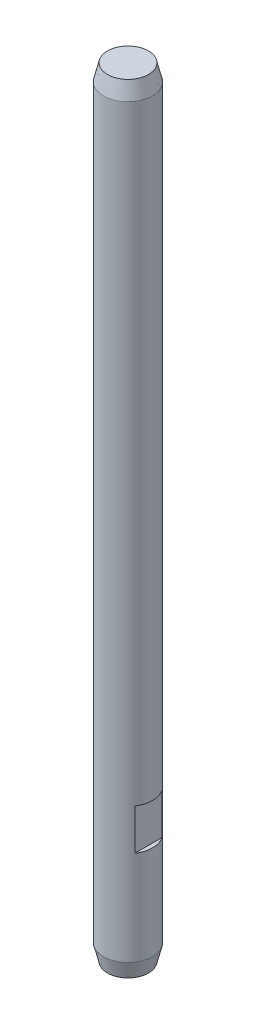
ISO-10303-21;
HEADER;
FILE_DESCRIPTION(('STEP AP214'),'2;1');
FILE_NAME('part.step','',(''),(''),'','','');
FILE_SCHEMA(('AUTOMOTIVE_DESIGN { 1 0 10303 214 1 1 1 1 }'));
ENDSEC;
DATA;
#1=APPLICATION_CONTEXT('core data for automotive mechanical design processes');
#2=APPLICATION_PROTOCOL_DEFINITION('international standard','automotive_design',2000,#1);
#3=PRODUCT_CONTEXT('',#1,'mechanical');
#4=PRODUCT('Part','Part','',(#3));
#5=PRODUCT_RELATED_PRODUCT_CATEGORY('part','',(#4));
#6=PRODUCT_DEFINITION_FORMATION('','',#4);
#7=PRODUCT_DEFINITION_CONTEXT('part definition',#1,'design');
#8=PRODUCT_DEFINITION('design','',#6,#7);
#9=PRODUCT_DEFINITION_SHAPE('','',#8);
#10=(LENGTH_UNIT() NAMED_UNIT(*) SI_UNIT(.MILLI.,.METRE.));
#11=(NAMED_UNIT(*) PLANE_ANGLE_UNIT() SI_UNIT($,.RADIAN.));
#12=(NAMED_UNIT(*) SI_UNIT($,.STERADIAN.) SOLID_ANGLE_UNIT());
#13=UNCERTAINTY_MEASURE_WITH_UNIT(LENGTH_MEASURE(1.E-05),#10,'distance_accuracy_value','');
#14=(GEOMETRIC_REPRESENTATION_CONTEXT(3) GLOBAL_UNCERTAINTY_ASSIGNED_CONTEXT((#13)) GLOBAL_UNIT_ASSIGNED_CONTEXT((#10,
#11,#12)) REPRESENTATION_CONTEXT('',''));
#15=CARTESIAN_POINT('',(0.,0.,0.));
#16=DIRECTION('',(0.,0.,1.));
#17=DIRECTION('',(1.,0.,0.));
#18=AXIS2_PLACEMENT_3D('',#15,#16,#17);
#19=CARTESIAN_POINT('',(0.,95.,0.));
#20=DIRECTION('',(0.,-1.,0.));
#21=DIRECTION('',(0.,0.,-1.));
#22=AXIS2_PLACEMENT_3D('',#19,#20,#21);
#23=CYLINDRICAL_SURFACE('',#22,3.);
#24=DIRECTION('',(0.,-1.,0.));
#25=VECTOR('',#24,1.);
#26=CARTESIAN_POINT('',(2.5,95.,-1.6583123951777));
#27=LINE('',#26,#25);
#28=CARTESIAN_POINT('',(2.5,13.5,-1.6583123951777));
#29=VERTEX_POINT('',#28);
#30=CARTESIAN_POINT('',(2.5,18.5,-1.6583123951777));
#31=VERTEX_POINT('',#30);
#32=EDGE_CURVE('E41',#29,#31,#27,.F.);
#33=ORIENTED_EDGE('',*,*,#32,.F.);
#34=CARTESIAN_POINT('',(0.,13.5,0.));
#35=DIRECTION('',(0.,-1.,0.));
#36=DIRECTION('',(0.,0.,-1.));
#37=AXIS2_PLACEMENT_3D('',#34,#35,#36);
#38=CIRCLE('',#37,3.);
#39=CARTESIAN_POINT('',(2.5,13.5,1.6583123951777));
#40=VERTEX_POINT('',#39);
#41=EDGE_CURVE('E47',#29,#40,#38,.T.);
#42=ORIENTED_EDGE('',*,*,#41,.T.);
#43=DIRECTION('',(0.,-1.,0.));
#44=VECTOR('',#43,1.);
#45=CARTESIAN_POINT('',(2.5,95.,1.6583123951777));
#46=LINE('',#45,#44);
#47=CARTESIAN_POINT('',(2.5,18.5,1.6583123951777));
#48=VERTEX_POINT('',#47);
#49=EDGE_CURVE('E11',#48,#40,#46,.T.);
#50=ORIENTED_EDGE('',*,*,#49,.F.);
#51=CARTESIAN_POINT('',(0.,18.5,0.));
#52=DIRECTION('',(0.,1.,0.));
#53=DIRECTION('',(0.,0.,1.));
#54=AXIS2_PLACEMENT_3D('',#51,#52,#53);
#55=CIRCLE('',#54,3.);
#56=EDGE_CURVE('E54',#48,#31,#55,.T.);
#57=ORIENTED_EDGE('',*,*,#56,.T.);
#58=EDGE_LOOP('',(#33,#42,#50,#57));
#59=FACE_BOUND('',#58,.T.);
#60=CARTESIAN_POINT('',(0.,93.,0.));
#61=DIRECTION('',(0.,1.,0.));
#62=DIRECTION('',(0.,0.,1.));
#63=AXIS2_PLACEMENT_3D('',#60,#61,#62);
#64=CIRCLE('',#63,3.);
#65=CARTESIAN_POINT('',(0.,93.,3.));
#66=VERTEX_POINT('',#65);
#67=EDGE_CURVE('E72',#66,#66,#64,.F.);
#68=ORIENTED_EDGE('',*,*,#67,.T.);
#69=EDGE_LOOP('',(#68));
#70=FACE_BOUND('',#69,.T.);
#71=CARTESIAN_POINT('',(0.,2.0000000000002,0.));
#72=DIRECTION('',(0.,1.,0.));
#73=DIRECTION('',(0.,0.,1.));
#74=AXIS2_PLACEMENT_3D('',#71,#72,#73);
#75=CIRCLE('',#74,3.);
#76=CARTESIAN_POINT('',(0.,2.0000000000002,3.));
#77=VERTEX_POINT('',#76);
#78=EDGE_CURVE('E68',#77,#77,#75,.T.);
#79=ORIENTED_EDGE('',*,*,#78,.T.);
#80=EDGE_LOOP('',(#79));
#81=FACE_BOUND('',#80,.T.);
#82=ADVANCED_FACE('F33',(#59,#70,#81),#23,.T.);
#83=CARTESIAN_POINT('',(0.,95.,0.));
#84=DIRECTION('',(0.,1.,0.));
#85=DIRECTION('',(0.,0.,1.));
#86=AXIS2_PLACEMENT_3D('',#83,#84,#85);
#87=PLANE('',#86);
#88=CARTESIAN_POINT('',(0.,95.,0.));
#89=DIRECTION('',(0.,1.,0.));
#90=DIRECTION('',(0.,0.,1.));
#91=AXIS2_PLACEMENT_3D('',#88,#89,#90);
#92=CIRCLE('',#91,2.5);
#93=CARTESIAN_POINT('',(0.,95.,2.5));
#94=VERTEX_POINT('',#93);
#95=EDGE_CURVE('E77',#94,#94,#92,.T.);
#96=ORIENTED_EDGE('',*,*,#95,.T.);
#97=EDGE_LOOP('',(#96));
#98=FACE_BOUND('',#97,.T.);
#99=ADVANCED_FACE('F97',(#98),#87,.T.);
#100=CARTESIAN_POINT('',(0.,0.,0.));
#101=DIRECTION('',(0.,1.,0.));
#102=DIRECTION('',(0.,0.,1.));
#103=AXIS2_PLACEMENT_3D('',#100,#101,#102);
#104=PLANE('',#103);
#105=CARTESIAN_POINT('',(0.,0.,0.));
#106=DIRECTION('',(0.,1.,0.));
#107=DIRECTION('',(0.,0.,1.));
#108=AXIS2_PLACEMENT_3D('',#105,#106,#107);
#109=CIRCLE('',#108,2.49999999999996);
#110=CARTESIAN_POINT('',(0.,0.,2.49999999999996));
#111=VERTEX_POINT('',#110);
#112=EDGE_CURVE('E80',#111,#111,#109,.F.);
#113=ORIENTED_EDGE('',*,*,#112,.T.);
#114=EDGE_LOOP('',(#113));
#115=FACE_BOUND('',#114,.T.);
#116=ADVANCED_FACE('F90',(#115),#104,.F.);
#117=CARTESIAN_POINT('',(0.,2.0000000000002,0.));
#118=DIRECTION('',(0.,1.,0.));
#119=DIRECTION('',(0.,0.,1.));
#120=AXIS2_PLACEMENT_3D('',#117,#118,#119);
#121=CONICAL_SURFACE('',#120,3.,0.24497866312686);
#122=ORIENTED_EDGE('',*,*,#112,.F.);
#123=EDGE_LOOP('',(#122));
#124=FACE_BOUND('',#123,.T.);
#125=ORIENTED_EDGE('',*,*,#78,.F.);
#126=EDGE_LOOP('',(#125));
#127=FACE_BOUND('',#126,.T.);
#128=ADVANCED_FACE('F88',(#124,#127),#121,.T.);
#129=CARTESIAN_POINT('',(0.,95.,0.));
#130=DIRECTION('',(0.,-1.,0.));
#131=DIRECTION('',(0.,0.,-1.));
#132=AXIS2_PLACEMENT_3D('',#129,#130,#131);
#133=CONICAL_SURFACE('',#132,2.5,0.24497866312686);
#134=ORIENTED_EDGE('',*,*,#67,.F.);
#135=EDGE_LOOP('',(#134));
#136=FACE_BOUND('',#135,.T.);
#137=ORIENTED_EDGE('',*,*,#95,.F.);
#138=EDGE_LOOP('',(#137));
#139=FACE_BOUND('',#138,.T.);
#140=ADVANCED_FACE('F35',(#136,#139),#133,.T.);
#141=CARTESIAN_POINT('',(2.5,13.5,3.));
#142=DIRECTION('',(0.,-1.,0.));
#143=DIRECTION('',(0.,0.,-1.));
#144=AXIS2_PLACEMENT_3D('',#141,#142,#143);
#145=PLANE('',#144);
#146=DIRECTION('',(0.,0.,-1.));
#147=VECTOR('',#146,1.);
#148=CARTESIAN_POINT('',(2.5,13.5,3.));
#149=LINE('',#148,#147);
#150=EDGE_CURVE('E63',#40,#29,#149,.T.);
#151=ORIENTED_EDGE('',*,*,#150,.F.);
#152=ORIENTED_EDGE('',*,*,#41,.F.);
#153=EDGE_LOOP('',(#151,#152));
#154=FACE_BOUND('',#153,.T.);
#155=ADVANCED_FACE('F67',(#154),#145,.F.);
#156=CARTESIAN_POINT('',(2.5,18.5,3.00000000000001));
#157=DIRECTION('',(0.,1.,0.));
#158=DIRECTION('',(0.,0.,1.));
#159=AXIS2_PLACEMENT_3D('',#156,#157,#158);
#160=PLANE('',#159);
#161=DIRECTION('',(0.,0.,1.));
#162=VECTOR('',#161,1.);
#163=CARTESIAN_POINT('',(2.5,18.5,3.00000000000001));
#164=LINE('',#163,#162);
#165=EDGE_CURVE('E65',#31,#48,#164,.T.);
#166=ORIENTED_EDGE('',*,*,#165,.F.);
#167=ORIENTED_EDGE('',*,*,#56,.F.);
#168=EDGE_LOOP('',(#166,#167));
#169=FACE_BOUND('',#168,.T.);
#170=ADVANCED_FACE('F109',(#169),#160,.F.);
#171=CARTESIAN_POINT('',(2.5,0.,0.));
#172=DIRECTION('',(1.,0.,0.));
#173=DIRECTION('',(0.,0.,-1.));
#174=AXIS2_PLACEMENT_3D('',#171,#172,#173);
#175=PLANE('',#174);
#176=ORIENTED_EDGE('',*,*,#49,.T.);
#177=ORIENTED_EDGE('',*,*,#150,.T.);
#178=ORIENTED_EDGE('',*,*,#32,.T.);
#179=ORIENTED_EDGE('',*,*,#165,.T.);
#180=EDGE_LOOP('',(#176,#177,#178,#179));
#181=FACE_BOUND('',#180,.T.);
#182=ADVANCED_FACE('F62',(#181),#175,.T.);
#183=CLOSED_SHELL('',(#82,#99,#116,#128,#140,#155,#170,#182));
#184=MANIFOLD_SOLID_BREP('B2',#183);
#185=ADVANCED_BREP_SHAPE_REPRESENTATION('',(#18,#184),#14);
#186=SHAPE_DEFINITION_REPRESENTATION(#9,#185);
ENDSEC;
END-ISO-10303-21;
